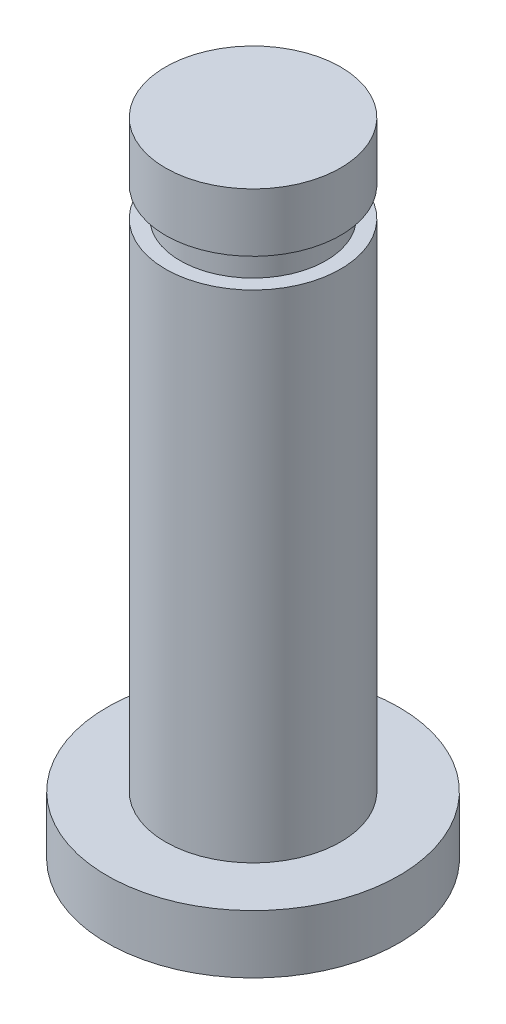
ISO-10303-21;
HEADER;
FILE_DESCRIPTION(('STEP AP214'),'2;1');
FILE_NAME('part.step','',(''),(''),'','','');
FILE_SCHEMA(('AUTOMOTIVE_DESIGN { 1 0 10303 214 1 1 1 1 }'));
ENDSEC;
DATA;
#1=APPLICATION_CONTEXT('core data for automotive mechanical design processes');
#2=APPLICATION_PROTOCOL_DEFINITION('international standard','automotive_design',2000,#1);
#3=PRODUCT_CONTEXT('',#1,'mechanical');
#4=PRODUCT('Part','Part','',(#3));
#5=PRODUCT_RELATED_PRODUCT_CATEGORY('part','',(#4));
#6=PRODUCT_DEFINITION_FORMATION('','',#4);
#7=PRODUCT_DEFINITION_CONTEXT('part definition',#1,'design');
#8=PRODUCT_DEFINITION('design','',#6,#7);
#9=PRODUCT_DEFINITION_SHAPE('','',#8);
#10=(LENGTH_UNIT() NAMED_UNIT(*) SI_UNIT(.MILLI.,.METRE.));
#11=(NAMED_UNIT(*) PLANE_ANGLE_UNIT() SI_UNIT($,.RADIAN.));
#12=(NAMED_UNIT(*) SI_UNIT($,.STERADIAN.) SOLID_ANGLE_UNIT());
#13=UNCERTAINTY_MEASURE_WITH_UNIT(LENGTH_MEASURE(1.E-05),#10,'distance_accuracy_value','');
#14=(GEOMETRIC_REPRESENTATION_CONTEXT(3) GLOBAL_UNCERTAINTY_ASSIGNED_CONTEXT((#13)) GLOBAL_UNIT_ASSIGNED_CONTEXT((#10,
#11,#12)) REPRESENTATION_CONTEXT('',''));
#15=CARTESIAN_POINT('',(0.,0.,0.));
#16=DIRECTION('',(0.,0.,1.));
#17=DIRECTION('',(1.,0.,0.));
#18=AXIS2_PLACEMENT_3D('',#15,#16,#17);
#19=CARTESIAN_POINT('',(5.,0.,0.));
#20=DIRECTION('',(0.,1.,0.));
#21=DIRECTION('',(0.,0.,1.));
#22=AXIS2_PLACEMENT_3D('',#19,#20,#21);
#23=PLANE('',#22);
#24=CARTESIAN_POINT('',(0.,0.,0.));
#25=DIRECTION('',(0.,-1.,0.));
#26=DIRECTION('',(0.,0.,-1.));
#27=AXIS2_PLACEMENT_3D('',#24,#25,#26);
#28=CIRCLE('',#27,3.);
#29=CARTESIAN_POINT('',(0.,0.,-3.));
#30=VERTEX_POINT('',#29);
#31=EDGE_CURVE('E74',#30,#30,#28,.T.);
#32=ORIENTED_EDGE('',*,*,#31,.T.);
#33=EDGE_LOOP('',(#32));
#34=FACE_BOUND('',#33,.T.);
#35=CARTESIAN_POINT('',(0.,0.,0.));
#36=DIRECTION('',(0.,-1.,0.));
#37=DIRECTION('',(0.,0.,-1.));
#38=AXIS2_PLACEMENT_3D('',#35,#36,#37);
#39=CIRCLE('',#38,5.);
#40=CARTESIAN_POINT('',(0.,0.,-5.));
#41=VERTEX_POINT('',#40);
#42=EDGE_CURVE('E10',#41,#41,#39,.T.);
#43=ORIENTED_EDGE('',*,*,#42,.F.);
#44=EDGE_LOOP('',(#43));
#45=FACE_BOUND('',#44,.T.);
#46=ADVANCED_FACE('F39',(#34,#45),#23,.T.);
#47=CARTESIAN_POINT('',(0.,0.,0.));
#48=DIRECTION('',(0.,-1.,0.));
#49=DIRECTION('',(0.,0.,-1.));
#50=AXIS2_PLACEMENT_3D('',#47,#48,#49);
#51=CYLINDRICAL_SURFACE('',#50,5.);
#52=ORIENTED_EDGE('',*,*,#42,.T.);
#53=EDGE_LOOP('',(#52));
#54=FACE_BOUND('',#53,.T.);
#55=CARTESIAN_POINT('',(0.,-2.,0.));
#56=DIRECTION('',(0.,-1.,0.));
#57=DIRECTION('',(0.,0.,-1.));
#58=AXIS2_PLACEMENT_3D('',#55,#56,#57);
#59=CIRCLE('',#58,5.);
#60=CARTESIAN_POINT('',(0.,-2.,-5.));
#61=VERTEX_POINT('',#60);
#62=EDGE_CURVE('E46',#61,#61,#59,.T.);
#63=ORIENTED_EDGE('',*,*,#62,.F.);
#64=EDGE_LOOP('',(#63));
#65=FACE_BOUND('',#64,.T.);
#66=ADVANCED_FACE('F93',(#54,#65),#51,.T.);
#67=CARTESIAN_POINT('',(0.,-2.,0.));
#68=DIRECTION('',(0.,-1.,0.));
#69=DIRECTION('',(0.,0.,-1.));
#70=AXIS2_PLACEMENT_3D('',#67,#68,#69);
#71=PLANE('',#70);
#72=ORIENTED_EDGE('',*,*,#62,.T.);
#73=EDGE_LOOP('',(#72));
#74=FACE_BOUND('',#73,.T.);
#75=ADVANCED_FACE('F97',(#74),#71,.T.);
#76=CARTESIAN_POINT('',(3.,20.,0.));
#77=DIRECTION('',(0.,1.,0.));
#78=DIRECTION('',(0.,0.,1.));
#79=AXIS2_PLACEMENT_3D('',#76,#77,#78);
#80=PLANE('',#79);
#81=CARTESIAN_POINT('',(0.,20.,0.));
#82=DIRECTION('',(0.,-1.,0.));
#83=DIRECTION('',(0.,0.,-1.));
#84=AXIS2_PLACEMENT_3D('',#81,#82,#83);
#85=CIRCLE('',#84,3.);
#86=CARTESIAN_POINT('',(0.,20.,-3.));
#87=VERTEX_POINT('',#86);
#88=EDGE_CURVE('E51',#87,#87,#85,.T.);
#89=ORIENTED_EDGE('',*,*,#88,.F.);
#90=EDGE_LOOP('',(#89));
#91=FACE_BOUND('',#90,.T.);
#92=ADVANCED_FACE('F101',(#91),#80,.T.);
#93=CARTESIAN_POINT('',(0.,0.,0.));
#94=DIRECTION('',(0.,-1.,0.));
#95=DIRECTION('',(0.,0.,-1.));
#96=AXIS2_PLACEMENT_3D('',#93,#94,#95);
#97=CYLINDRICAL_SURFACE('',#96,3.);
#98=ORIENTED_EDGE('',*,*,#88,.T.);
#99=EDGE_LOOP('',(#98));
#100=FACE_BOUND('',#99,.T.);
#101=CARTESIAN_POINT('',(0.,18.,0.));
#102=DIRECTION('',(0.,-1.,0.));
#103=DIRECTION('',(0.,0.,-1.));
#104=AXIS2_PLACEMENT_3D('',#101,#102,#103);
#105=CIRCLE('',#104,3.);
#106=CARTESIAN_POINT('',(0.,18.,-3.));
#107=VERTEX_POINT('',#106);
#108=EDGE_CURVE('E56',#107,#107,#105,.T.);
#109=ORIENTED_EDGE('',*,*,#108,.F.);
#110=EDGE_LOOP('',(#109));
#111=FACE_BOUND('',#110,.T.);
#112=ADVANCED_FACE('F107',(#100,#111),#97,.T.);
#113=CARTESIAN_POINT('',(2.5,18.,0.));
#114=DIRECTION('',(0.,-1.,0.));
#115=DIRECTION('',(0.,0.,-1.));
#116=AXIS2_PLACEMENT_3D('',#113,#114,#115);
#117=PLANE('',#116);
#118=ORIENTED_EDGE('',*,*,#108,.T.);
#119=EDGE_LOOP('',(#118));
#120=FACE_BOUND('',#119,.T.);
#121=CARTESIAN_POINT('',(0.,18.,0.));
#122=DIRECTION('',(0.,-1.,0.));
#123=DIRECTION('',(0.,0.,-1.));
#124=AXIS2_PLACEMENT_3D('',#121,#122,#123);
#125=CIRCLE('',#124,2.5);
#126=CARTESIAN_POINT('',(0.,18.,-2.5));
#127=VERTEX_POINT('',#126);
#128=EDGE_CURVE('E62',#127,#127,#125,.T.);
#129=ORIENTED_EDGE('',*,*,#128,.F.);
#130=EDGE_LOOP('',(#129));
#131=FACE_BOUND('',#130,.T.);
#132=ADVANCED_FACE('F111',(#120,#131),#117,.T.);
#133=CARTESIAN_POINT('',(0.,0.,0.));
#134=DIRECTION('',(0.,-1.,0.));
#135=DIRECTION('',(0.,0.,-1.));
#136=AXIS2_PLACEMENT_3D('',#133,#134,#135);
#137=CYLINDRICAL_SURFACE('',#136,2.5);
#138=ORIENTED_EDGE('',*,*,#128,.T.);
#139=EDGE_LOOP('',(#138));
#140=FACE_BOUND('',#139,.T.);
#141=CARTESIAN_POINT('',(0.,17.,0.));
#142=DIRECTION('',(0.,-1.,0.));
#143=DIRECTION('',(0.,0.,-1.));
#144=AXIS2_PLACEMENT_3D('',#141,#142,#143);
#145=CIRCLE('',#144,2.5);
#146=CARTESIAN_POINT('',(0.,17.,-2.5));
#147=VERTEX_POINT('',#146);
#148=EDGE_CURVE('E66',#147,#147,#145,.T.);
#149=ORIENTED_EDGE('',*,*,#148,.F.);
#150=EDGE_LOOP('',(#149));
#151=FACE_BOUND('',#150,.T.);
#152=ADVANCED_FACE('F89',(#140,#151),#137,.T.);
#153=CARTESIAN_POINT('',(3.,17.,0.));
#154=DIRECTION('',(0.,1.,0.));
#155=DIRECTION('',(0.,0.,1.));
#156=AXIS2_PLACEMENT_3D('',#153,#154,#155);
#157=PLANE('',#156);
#158=ORIENTED_EDGE('',*,*,#148,.T.);
#159=EDGE_LOOP('',(#158));
#160=FACE_BOUND('',#159,.T.);
#161=CARTESIAN_POINT('',(0.,17.,0.));
#162=DIRECTION('',(0.,-1.,0.));
#163=DIRECTION('',(0.,0.,-1.));
#164=AXIS2_PLACEMENT_3D('',#161,#162,#163);
#165=CIRCLE('',#164,3.);
#166=CARTESIAN_POINT('',(0.,17.,-3.));
#167=VERTEX_POINT('',#166);
#168=EDGE_CURVE('E70',#167,#167,#165,.T.);
#169=ORIENTED_EDGE('',*,*,#168,.F.);
#170=EDGE_LOOP('',(#169));
#171=FACE_BOUND('',#170,.T.);
#172=ADVANCED_FACE('F83',(#160,#171),#157,.T.);
#173=CARTESIAN_POINT('',(0.,0.,0.));
#174=DIRECTION('',(0.,-1.,0.));
#175=DIRECTION('',(0.,0.,-1.));
#176=AXIS2_PLACEMENT_3D('',#173,#174,#175);
#177=CYLINDRICAL_SURFACE('',#176,3.);
#178=ORIENTED_EDGE('',*,*,#168,.T.);
#179=EDGE_LOOP('',(#178));
#180=FACE_BOUND('',#179,.T.);
#181=ORIENTED_EDGE('',*,*,#31,.F.);
#182=EDGE_LOOP('',(#181));
#183=FACE_BOUND('',#182,.T.);
#184=ADVANCED_FACE('F81',(#180,#183),#177,.T.);
#185=CLOSED_SHELL('',(#46,#66,#75,#92,#112,#132,#152,#172,#184));
#186=MANIFOLD_SOLID_BREP('B2',#185);
#187=ADVANCED_BREP_SHAPE_REPRESENTATION('',(#18,#186),#14);
#188=SHAPE_DEFINITION_REPRESENTATION(#9,#187);
ENDSEC;
END-ISO-10303-21;
